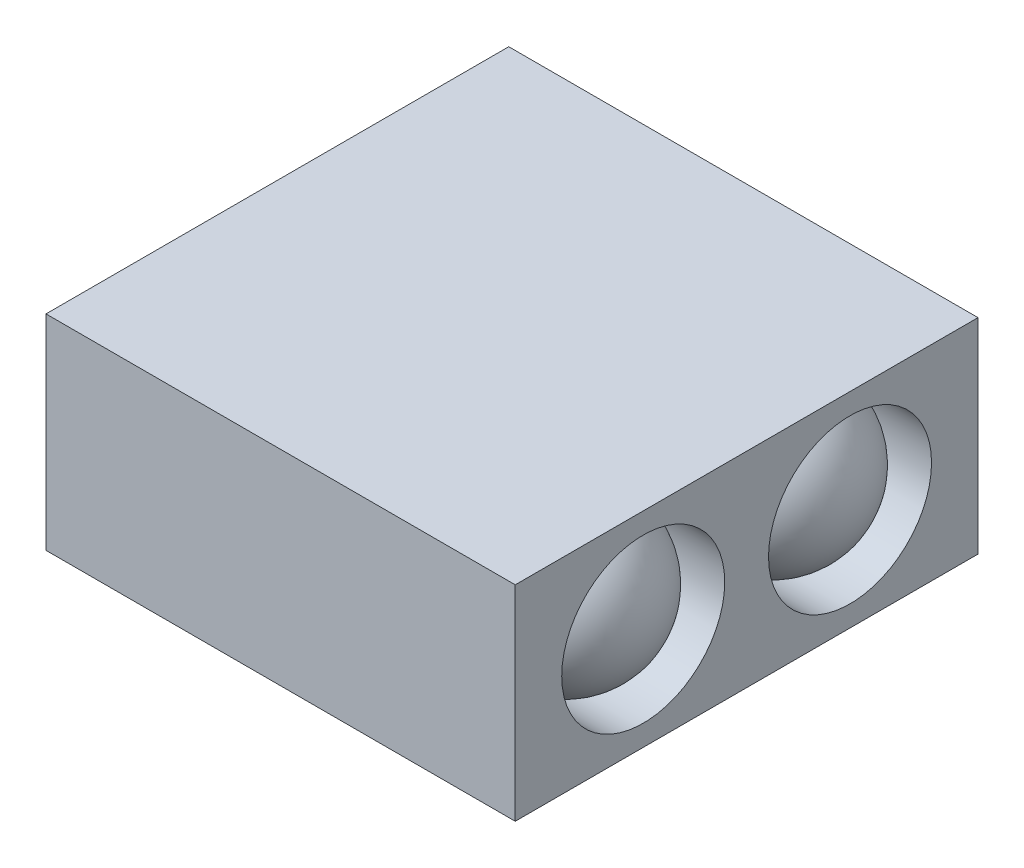
ISO-10303-21;
HEADER;
FILE_DESCRIPTION(('STEP AP214'),'2;1');
FILE_NAME('part.step','',(''),(''),'','','');
FILE_SCHEMA(('AUTOMOTIVE_DESIGN { 1 0 10303 214 1 1 1 1 }'));
ENDSEC;
DATA;
#1=APPLICATION_CONTEXT('core data for automotive mechanical design processes');
#2=APPLICATION_PROTOCOL_DEFINITION('international standard','automotive_design',2000,#1);
#3=PRODUCT_CONTEXT('',#1,'mechanical');
#4=PRODUCT('Part','Part','',(#3));
#5=PRODUCT_RELATED_PRODUCT_CATEGORY('part','',(#4));
#6=PRODUCT_DEFINITION_FORMATION('','',#4);
#7=PRODUCT_DEFINITION_CONTEXT('part definition',#1,'design');
#8=PRODUCT_DEFINITION('design','',#6,#7);
#9=PRODUCT_DEFINITION_SHAPE('','',#8);
#10=(LENGTH_UNIT() NAMED_UNIT(*) SI_UNIT(.MILLI.,.METRE.));
#11=(NAMED_UNIT(*) PLANE_ANGLE_UNIT() SI_UNIT($,.RADIAN.));
#12=(NAMED_UNIT(*) SI_UNIT($,.STERADIAN.) SOLID_ANGLE_UNIT());
#13=UNCERTAINTY_MEASURE_WITH_UNIT(LENGTH_MEASURE(1.E-05),#10,'distance_accuracy_value','');
#14=(GEOMETRIC_REPRESENTATION_CONTEXT(3) GLOBAL_UNCERTAINTY_ASSIGNED_CONTEXT((#13)) GLOBAL_UNIT_ASSIGNED_CONTEXT((#10,
#11,#12)) REPRESENTATION_CONTEXT('',''));
#15=CARTESIAN_POINT('',(0.,0.,0.));
#16=DIRECTION('',(0.,0.,1.));
#17=DIRECTION('',(1.,0.,0.));
#18=AXIS2_PLACEMENT_3D('',#15,#16,#17);
#19=CARTESIAN_POINT('',(181.,158.,178.5));
#20=DIRECTION('',(-1.,0.,0.));
#21=DIRECTION('',(0.,0.,1.));
#22=AXIS2_PLACEMENT_3D('',#19,#20,#21);
#23=PLANE('',#22);
#24=CARTESIAN_POINT('',(181.,79.,79.7740259901767));
#25=DIRECTION('',(1.,0.,0.));
#26=DIRECTION('',(0.,0.,-1.));
#27=AXIS2_PLACEMENT_3D('',#24,#25,#26);
#28=CIRCLE('',#27,62.8771162109275);
#29=CARTESIAN_POINT('',(181.,79.,16.8969097792492));
#30=VERTEX_POINT('',#29);
#31=EDGE_CURVE('E121',#30,#30,#28,.T.);
#32=ORIENTED_EDGE('',*,*,#31,.F.);
#33=EDGE_LOOP('',(#32));
#34=FACE_BOUND('',#33,.T.);
#35=CARTESIAN_POINT('',(181.,79.,-79.7740259901767));
#36=DIRECTION('',(1.,0.,0.));
#37=DIRECTION('',(0.,0.,1.));
#38=AXIS2_PLACEMENT_3D('',#35,#36,#37);
#39=CIRCLE('',#38,62.8771162109275);
#40=CARTESIAN_POINT('',(181.,79.,-142.651142201104));
#41=VERTEX_POINT('',#40);
#42=EDGE_CURVE('E115',#41,#41,#39,.T.);
#43=ORIENTED_EDGE('',*,*,#42,.F.);
#44=EDGE_LOOP('',(#43));
#45=FACE_BOUND('',#44,.T.);
#46=DIRECTION('',(0.,0.,-1.));
#47=VECTOR('',#46,1.);
#48=CARTESIAN_POINT('',(181.,0.,178.5));
#49=LINE('',#48,#47);
#50=CARTESIAN_POINT('',(181.,0.,178.5));
#51=VERTEX_POINT('',#50);
#52=CARTESIAN_POINT('',(181.,0.,-178.5));
#53=VERTEX_POINT('',#52);
#54=EDGE_CURVE('E101',#51,#53,#49,.T.);
#55=ORIENTED_EDGE('',*,*,#54,.T.);
#56=DIRECTION('',(0.,-1.,0.));
#57=VECTOR('',#56,1.);
#58=CARTESIAN_POINT('',(181.,158.,-178.5));
#59=LINE('',#58,#57);
#60=CARTESIAN_POINT('',(181.,158.,-178.5));
#61=VERTEX_POINT('',#60);
#62=EDGE_CURVE('E11',#61,#53,#59,.T.);
#63=ORIENTED_EDGE('',*,*,#62,.F.);
#64=DIRECTION('',(0.,0.,-1.));
#65=VECTOR('',#64,1.);
#66=CARTESIAN_POINT('',(181.,158.,178.5));
#67=LINE('',#66,#65);
#68=CARTESIAN_POINT('',(181.,158.,178.5));
#69=VERTEX_POINT('',#68);
#70=EDGE_CURVE('E89',#69,#61,#67,.T.);
#71=ORIENTED_EDGE('',*,*,#70,.F.);
#72=DIRECTION('',(0.,-1.,0.));
#73=VECTOR('',#72,1.);
#74=CARTESIAN_POINT('',(181.,158.,178.5));
#75=LINE('',#74,#73);
#76=EDGE_CURVE('E97',#69,#51,#75,.T.);
#77=ORIENTED_EDGE('',*,*,#76,.T.);
#78=EDGE_LOOP('',(#55,#63,#71,#77));
#79=FACE_BOUND('',#78,.T.);
#80=ADVANCED_FACE('F38',(#34,#45,#79),#23,.F.);
#81=CARTESIAN_POINT('',(-181.,158.,-178.5));
#82=DIRECTION('',(0.,0.,1.));
#83=DIRECTION('',(1.,0.,0.));
#84=AXIS2_PLACEMENT_3D('',#81,#82,#83);
#85=PLANE('',#84);
#86=DIRECTION('',(-1.,0.,0.));
#87=VECTOR('',#86,1.);
#88=CARTESIAN_POINT('',(-181.,0.,-178.5));
#89=LINE('',#88,#87);
#90=CARTESIAN_POINT('',(-181.,0.,-178.5));
#91=VERTEX_POINT('',#90);
#92=EDGE_CURVE('E93',#53,#91,#89,.T.);
#93=ORIENTED_EDGE('',*,*,#92,.T.);
#94=DIRECTION('',(0.,-1.,0.));
#95=VECTOR('',#94,1.);
#96=CARTESIAN_POINT('',(-181.,158.,-178.5));
#97=LINE('',#96,#95);
#98=CARTESIAN_POINT('',(-181.,158.,-178.5));
#99=VERTEX_POINT('',#98);
#100=EDGE_CURVE('E46',#99,#91,#97,.T.);
#101=ORIENTED_EDGE('',*,*,#100,.F.);
#102=DIRECTION('',(-1.,0.,0.));
#103=VECTOR('',#102,1.);
#104=CARTESIAN_POINT('',(-181.,158.,-178.5));
#105=LINE('',#104,#103);
#106=EDGE_CURVE('E84',#61,#99,#105,.T.);
#107=ORIENTED_EDGE('',*,*,#106,.F.);
#108=ORIENTED_EDGE('',*,*,#62,.T.);
#109=EDGE_LOOP('',(#93,#101,#107,#108));
#110=FACE_BOUND('',#109,.T.);
#111=ADVANCED_FACE('F92',(#110),#85,.F.);
#112=CARTESIAN_POINT('',(-181.,158.,178.5));
#113=DIRECTION('',(1.,0.,0.));
#114=DIRECTION('',(0.,0.,-1.));
#115=AXIS2_PLACEMENT_3D('',#112,#113,#114);
#116=PLANE('',#115);
#117=DIRECTION('',(0.,0.,1.));
#118=VECTOR('',#117,1.);
#119=CARTESIAN_POINT('',(-181.,0.,178.5));
#120=LINE('',#119,#118);
#121=CARTESIAN_POINT('',(-181.,0.,178.5));
#122=VERTEX_POINT('',#121);
#123=EDGE_CURVE('E71',#91,#122,#120,.T.);
#124=ORIENTED_EDGE('',*,*,#123,.T.);
#125=DIRECTION('',(0.,-1.,0.));
#126=VECTOR('',#125,1.);
#127=CARTESIAN_POINT('',(-181.,158.,178.5));
#128=LINE('',#127,#126);
#129=CARTESIAN_POINT('',(-181.,158.,178.5));
#130=VERTEX_POINT('',#129);
#131=EDGE_CURVE('E94',#130,#122,#128,.T.);
#132=ORIENTED_EDGE('',*,*,#131,.F.);
#133=DIRECTION('',(0.,0.,1.));
#134=VECTOR('',#133,1.);
#135=CARTESIAN_POINT('',(-181.,158.,178.5));
#136=LINE('',#135,#134);
#137=EDGE_CURVE('E87',#99,#130,#136,.T.);
#138=ORIENTED_EDGE('',*,*,#137,.F.);
#139=ORIENTED_EDGE('',*,*,#100,.T.);
#140=EDGE_LOOP('',(#124,#132,#138,#139));
#141=FACE_BOUND('',#140,.T.);
#142=ADVANCED_FACE('F95',(#141),#116,.F.);
#143=CARTESIAN_POINT('',(-181.,158.,178.5));
#144=DIRECTION('',(0.,0.,-1.));
#145=DIRECTION('',(-1.,0.,0.));
#146=AXIS2_PLACEMENT_3D('',#143,#144,#145);
#147=PLANE('',#146);
#148=DIRECTION('',(1.,0.,0.));
#149=VECTOR('',#148,1.);
#150=CARTESIAN_POINT('',(-181.,0.,178.5));
#151=LINE('',#150,#149);
#152=EDGE_CURVE('E77',#122,#51,#151,.T.);
#153=ORIENTED_EDGE('',*,*,#152,.T.);
#154=ORIENTED_EDGE('',*,*,#76,.F.);
#155=DIRECTION('',(1.,0.,0.));
#156=VECTOR('',#155,1.);
#157=CARTESIAN_POINT('',(-181.,158.,178.5));
#158=LINE('',#157,#156);
#159=EDGE_CURVE('E54',#130,#69,#158,.T.);
#160=ORIENTED_EDGE('',*,*,#159,.F.);
#161=ORIENTED_EDGE('',*,*,#131,.T.);
#162=EDGE_LOOP('',(#153,#154,#160,#161));
#163=FACE_BOUND('',#162,.T.);
#164=ADVANCED_FACE('F109',(#163),#147,.F.);
#165=CARTESIAN_POINT('',(0.,158.,0.));
#166=DIRECTION('',(0.,-1.,0.));
#167=DIRECTION('',(0.,0.,-1.));
#168=AXIS2_PLACEMENT_3D('',#165,#166,#167);
#169=PLANE('',#168);
#170=ORIENTED_EDGE('',*,*,#70,.T.);
#171=ORIENTED_EDGE('',*,*,#106,.T.);
#172=ORIENTED_EDGE('',*,*,#137,.T.);
#173=ORIENTED_EDGE('',*,*,#159,.T.);
#174=EDGE_LOOP('',(#170,#171,#172,#173));
#175=FACE_BOUND('',#174,.T.);
#176=ADVANCED_FACE('F85',(#175),#169,.F.);
#177=CARTESIAN_POINT('',(0.,0.,0.));
#178=DIRECTION('',(0.,-1.,0.));
#179=DIRECTION('',(0.,0.,-1.));
#180=AXIS2_PLACEMENT_3D('',#177,#178,#179);
#181=PLANE('',#180);
#182=ORIENTED_EDGE('',*,*,#54,.F.);
#183=ORIENTED_EDGE('',*,*,#152,.F.);
#184=ORIENTED_EDGE('',*,*,#123,.F.);
#185=ORIENTED_EDGE('',*,*,#92,.F.);
#186=EDGE_LOOP('',(#182,#183,#184,#185));
#187=FACE_BOUND('',#186,.T.);
#188=ADVANCED_FACE('F112',(#187),#181,.T.);
#189=CARTESIAN_POINT('',(121.,79.,-79.7740259901767));
#190=DIRECTION('',(1.,0.,0.));
#191=DIRECTION('',(0.,0.,-1.));
#192=AXIS2_PLACEMENT_3D('',#189,#190,#191);
#193=CYLINDRICAL_SURFACE('',#192,62.8771162109275);
#194=CARTESIAN_POINT('',(121.,79.,-79.7740259901767));
#195=DIRECTION('',(1.,0.,0.));
#196=DIRECTION('',(0.,0.,1.));
#197=AXIS2_PLACEMENT_3D('',#194,#195,#196);
#198=CIRCLE('',#197,62.8771162109275);
#199=CARTESIAN_POINT('',(121.,79.,-142.651142201104));
#200=VERTEX_POINT('',#199);
#201=EDGE_CURVE('E118',#200,#200,#198,.T.);
#202=CARTESIAN_POINT('',(121.,79.,-142.651142201104));
#203=CARTESIAN_POINT('',(121.625,79.,-142.651142201104));
#204=CARTESIAN_POINT('',(122.25,79.,-142.651142201104));
#205=CARTESIAN_POINT('',(123.5,79.,-142.651142201104));
#206=CARTESIAN_POINT('',(124.125,79.,-142.651142201104));
#207=CARTESIAN_POINT('',(125.375,79.,-142.651142201104));
#208=CARTESIAN_POINT('',(126.,79.,-142.651142201104));
#209=CARTESIAN_POINT('',(127.25,79.,-142.651142201104));
#210=CARTESIAN_POINT('',(127.875,79.,-142.651142201104));
#211=CARTESIAN_POINT('',(129.125,79.,-142.651142201104));
#212=CARTESIAN_POINT('',(129.75,79.,-142.651142201104));
#213=CARTESIAN_POINT('',(131.,79.,-142.651142201104));
#214=CARTESIAN_POINT('',(131.625,79.,-142.651142201104));
#215=CARTESIAN_POINT('',(132.875,79.,-142.651142201104));
#216=CARTESIAN_POINT('',(133.5,79.,-142.651142201104));
#217=CARTESIAN_POINT('',(134.75,79.,-142.651142201104));
#218=CARTESIAN_POINT('',(135.375,79.,-142.651142201104));
#219=CARTESIAN_POINT('',(136.625,79.,-142.651142201104));
#220=CARTESIAN_POINT('',(137.25,79.,-142.651142201104));
#221=CARTESIAN_POINT('',(138.5,79.,-142.651142201104));
#222=CARTESIAN_POINT('',(139.125,79.,-142.651142201104));
#223=CARTESIAN_POINT('',(140.375,79.,-142.651142201104));
#224=CARTESIAN_POINT('',(141.,79.,-142.651142201104));
#225=CARTESIAN_POINT('',(142.25,79.,-142.651142201104));
#226=CARTESIAN_POINT('',(142.875,79.,-142.651142201104));
#227=CARTESIAN_POINT('',(144.125,79.,-142.651142201104));
#228=CARTESIAN_POINT('',(144.75,79.,-142.651142201104));
#229=CARTESIAN_POINT('',(146.,79.,-142.651142201104));
#230=CARTESIAN_POINT('',(146.625,79.,-142.651142201104));
#231=CARTESIAN_POINT('',(147.875,79.,-142.651142201104));
#232=CARTESIAN_POINT('',(148.5,79.,-142.651142201104));
#233=CARTESIAN_POINT('',(149.75,79.,-142.651142201104));
#234=CARTESIAN_POINT('',(150.375,79.,-142.651142201104));
#235=CARTESIAN_POINT('',(151.625,79.,-142.651142201104));
#236=CARTESIAN_POINT('',(152.25,79.,-142.651142201104));
#237=CARTESIAN_POINT('',(153.5,79.,-142.651142201104));
#238=CARTESIAN_POINT('',(154.125,79.,-142.651142201104));
#239=CARTESIAN_POINT('',(155.375,79.,-142.651142201104));
#240=CARTESIAN_POINT('',(156.,79.,-142.651142201104));
#241=CARTESIAN_POINT('',(157.25,79.,-142.651142201104));
#242=CARTESIAN_POINT('',(157.875,79.,-142.651142201104));
#243=CARTESIAN_POINT('',(159.125,79.,-142.651142201104));
#244=CARTESIAN_POINT('',(159.75,79.,-142.651142201104));
#245=CARTESIAN_POINT('',(161.,79.,-142.651142201104));
#246=CARTESIAN_POINT('',(161.625,79.,-142.651142201104));
#247=CARTESIAN_POINT('',(162.875,79.,-142.651142201104));
#248=CARTESIAN_POINT('',(163.5,79.,-142.651142201104));
#249=CARTESIAN_POINT('',(164.75,79.,-142.651142201104));
#250=CARTESIAN_POINT('',(165.375,79.,-142.651142201104));
#251=CARTESIAN_POINT('',(166.625,79.,-142.651142201104));
#252=CARTESIAN_POINT('',(167.25,79.,-142.651142201104));
#253=CARTESIAN_POINT('',(168.5,79.,-142.651142201104));
#254=CARTESIAN_POINT('',(169.125,79.,-142.651142201104));
#255=CARTESIAN_POINT('',(170.375,79.,-142.651142201104));
#256=CARTESIAN_POINT('',(171.,79.,-142.651142201104));
#257=CARTESIAN_POINT('',(172.25,79.,-142.651142201104));
#258=CARTESIAN_POINT('',(172.875,79.,-142.651142201104));
#259=CARTESIAN_POINT('',(174.125,79.,-142.651142201104));
#260=CARTESIAN_POINT('',(174.75,79.,-142.651142201104));
#261=CARTESIAN_POINT('',(176.,79.,-142.651142201104));
#262=CARTESIAN_POINT('',(176.625,79.,-142.651142201104));
#263=CARTESIAN_POINT('',(177.875,79.,-142.651142201104));
#264=CARTESIAN_POINT('',(178.5,79.,-142.651142201104));
#265=CARTESIAN_POINT('',(179.75,79.,-142.651142201104));
#266=CARTESIAN_POINT('',(180.375,79.,-142.651142201104));
#267=CARTESIAN_POINT('',(181.,79.,-142.651142201104));
#268=B_SPLINE_CURVE_WITH_KNOTS('',3,(#202,#203,#204,#205,#206,#207,#208,#209,#210,#211,#212,
#213,#214,#215,#216,#217,#218,#219,#220,#221,#222,#223,#224,#225,#226,#227,#228,#229,#230,#231,
#232,#233,#234,#235,#236,#237,#238,#239,#240,#241,#242,#243,#244,#245,#246,#247,#248,#249,#250,
#251,#252,#253,#254,#255,#256,#257,#258,#259,#260,#261,#262,#263,#264,#265,#266,#267),
.UNSPECIFIED.,.F.,.F.,(4,2,2,2,2,2,2,2,2,2,2,2,2,2,2,2,2,2,2,2,2,2,2,2,2,2,2,2,2,2,2,2,4),(0.,
1.875,3.75,5.62500000000001,7.49999999999999,9.37500000000001,11.25,13.125,15.,16.875,18.75,
20.625,22.5,24.375,26.25,28.125,30.,31.875,33.75,35.625,37.5,39.375,41.25,43.125,45.,46.875,
48.75,50.625,52.5,54.375,56.25,58.125,60.),.UNSPECIFIED.);
#269=EDGE_CURVE('BSEAM132',#200,#41,#268,.T.);
#270=ORIENTED_EDGE('',*,*,#201,.F.);
#271=ORIENTED_EDGE('',*,*,#42,.T.);
#272=ORIENTED_EDGE('',*,*,#269,.T.);
#273=ORIENTED_EDGE('',*,*,#269,.F.);
#274=EDGE_LOOP('',(#270,#272,#271,#273));
#275=FACE_BOUND('',#274,.T.);
#276=ADVANCED_FACE('F132',(#275),#193,.F.);
#277=CARTESIAN_POINT('',(121.,79.,79.7740259901767));
#278=DIRECTION('',(1.,0.,0.));
#279=DIRECTION('',(0.,0.,-1.));
#280=AXIS2_PLACEMENT_3D('',#277,#278,#279);
#281=CYLINDRICAL_SURFACE('',#280,62.8771162109275);
#282=CARTESIAN_POINT('',(121.,79.,79.7740259901767));
#283=DIRECTION('',(1.,0.,0.));
#284=DIRECTION('',(0.,0.,-1.));
#285=AXIS2_PLACEMENT_3D('',#282,#283,#284);
#286=CIRCLE('',#285,62.8771162109275);
#287=CARTESIAN_POINT('',(121.,79.,16.8969097792492));
#288=VERTEX_POINT('',#287);
#289=EDGE_CURVE('E104',#288,#288,#286,.T.);
#290=CARTESIAN_POINT('',(121.,79.,16.8969097792492));
#291=CARTESIAN_POINT('',(121.625,79.,16.8969097792492));
#292=CARTESIAN_POINT('',(122.25,79.,16.8969097792492));
#293=CARTESIAN_POINT('',(123.5,79.,16.8969097792492));
#294=CARTESIAN_POINT('',(124.125,79.,16.8969097792492));
#295=CARTESIAN_POINT('',(125.375,79.,16.8969097792492));
#296=CARTESIAN_POINT('',(126.,79.,16.8969097792492));
#297=CARTESIAN_POINT('',(127.25,79.,16.8969097792492));
#298=CARTESIAN_POINT('',(127.875,79.,16.8969097792492));
#299=CARTESIAN_POINT('',(129.125,79.,16.8969097792492));
#300=CARTESIAN_POINT('',(129.75,79.,16.8969097792492));
#301=CARTESIAN_POINT('',(131.,79.,16.8969097792492));
#302=CARTESIAN_POINT('',(131.625,79.,16.8969097792492));
#303=CARTESIAN_POINT('',(132.875,79.,16.8969097792492));
#304=CARTESIAN_POINT('',(133.5,79.,16.8969097792492));
#305=CARTESIAN_POINT('',(134.75,79.,16.8969097792492));
#306=CARTESIAN_POINT('',(135.375,79.,16.8969097792492));
#307=CARTESIAN_POINT('',(136.625,79.,16.8969097792492));
#308=CARTESIAN_POINT('',(137.25,79.,16.8969097792492));
#309=CARTESIAN_POINT('',(138.5,79.,16.8969097792492));
#310=CARTESIAN_POINT('',(139.125,79.,16.8969097792492));
#311=CARTESIAN_POINT('',(140.375,79.,16.8969097792492));
#312=CARTESIAN_POINT('',(141.,79.,16.8969097792492));
#313=CARTESIAN_POINT('',(142.25,79.,16.8969097792492));
#314=CARTESIAN_POINT('',(142.875,79.,16.8969097792492));
#315=CARTESIAN_POINT('',(144.125,79.,16.8969097792492));
#316=CARTESIAN_POINT('',(144.75,79.,16.8969097792492));
#317=CARTESIAN_POINT('',(146.,79.,16.8969097792492));
#318=CARTESIAN_POINT('',(146.625,79.,16.8969097792492));
#319=CARTESIAN_POINT('',(147.875,79.,16.8969097792492));
#320=CARTESIAN_POINT('',(148.5,79.,16.8969097792492));
#321=CARTESIAN_POINT('',(149.75,79.,16.8969097792492));
#322=CARTESIAN_POINT('',(150.375,79.,16.8969097792492));
#323=CARTESIAN_POINT('',(151.625,79.,16.8969097792492));
#324=CARTESIAN_POINT('',(152.25,79.,16.8969097792492));
#325=CARTESIAN_POINT('',(153.5,79.,16.8969097792492));
#326=CARTESIAN_POINT('',(154.125,79.,16.8969097792492));
#327=CARTESIAN_POINT('',(155.375,79.,16.8969097792492));
#328=CARTESIAN_POINT('',(156.,79.,16.8969097792492));
#329=CARTESIAN_POINT('',(157.25,79.,16.8969097792492));
#330=CARTESIAN_POINT('',(157.875,79.,16.8969097792492));
#331=CARTESIAN_POINT('',(159.125,79.,16.8969097792492));
#332=CARTESIAN_POINT('',(159.75,79.,16.8969097792492));
#333=CARTESIAN_POINT('',(161.,79.,16.8969097792492));
#334=CARTESIAN_POINT('',(161.625,79.,16.8969097792492));
#335=CARTESIAN_POINT('',(162.875,79.,16.8969097792492));
#336=CARTESIAN_POINT('',(163.5,79.,16.8969097792492));
#337=CARTESIAN_POINT('',(164.75,79.,16.8969097792492));
#338=CARTESIAN_POINT('',(165.375,79.,16.8969097792492));
#339=CARTESIAN_POINT('',(166.625,79.,16.8969097792492));
#340=CARTESIAN_POINT('',(167.25,79.,16.8969097792492));
#341=CARTESIAN_POINT('',(168.5,79.,16.8969097792492));
#342=CARTESIAN_POINT('',(169.125,79.,16.8969097792492));
#343=CARTESIAN_POINT('',(170.375,79.,16.8969097792492));
#344=CARTESIAN_POINT('',(171.,79.,16.8969097792492));
#345=CARTESIAN_POINT('',(172.25,79.,16.8969097792492));
#346=CARTESIAN_POINT('',(172.875,79.,16.8969097792492));
#347=CARTESIAN_POINT('',(174.125,79.,16.8969097792492));
#348=CARTESIAN_POINT('',(174.75,79.,16.8969097792492));
#349=CARTESIAN_POINT('',(176.,79.,16.8969097792492));
#350=CARTESIAN_POINT('',(176.625,79.,16.8969097792492));
#351=CARTESIAN_POINT('',(177.875,79.,16.8969097792492));
#352=CARTESIAN_POINT('',(178.5,79.,16.8969097792492));
#353=CARTESIAN_POINT('',(179.75,79.,16.8969097792492));
#354=CARTESIAN_POINT('',(180.375,79.,16.8969097792492));
#355=CARTESIAN_POINT('',(181.,79.,16.8969097792492));
#356=B_SPLINE_CURVE_WITH_KNOTS('',3,(#290,#291,#292,#293,#294,#295,#296,#297,#298,#299,#300,
#301,#302,#303,#304,#305,#306,#307,#308,#309,#310,#311,#312,#313,#314,#315,#316,#317,#318,#319,
#320,#321,#322,#323,#324,#325,#326,#327,#328,#329,#330,#331,#332,#333,#334,#335,#336,#337,#338,
#339,#340,#341,#342,#343,#344,#345,#346,#347,#348,#349,#350,#351,#352,#353,#354,#355),
.UNSPECIFIED.,.F.,.F.,(4,2,2,2,2,2,2,2,2,2,2,2,2,2,2,2,2,2,2,2,2,2,2,2,2,2,2,2,2,2,2,2,4),(0.,
1.875,3.75,5.62500000000001,7.49999999999999,9.37500000000001,11.25,13.125,15.,16.875,18.75,
20.625,22.5,24.375,26.25,28.125,30.,31.875,33.75,35.625,37.5,39.375,41.25,43.125,45.,46.875,
48.75,50.625,52.5,54.375,56.25,58.125,60.),.UNSPECIFIED.);
#357=EDGE_CURVE('BSEAM129',#288,#30,#356,.T.);
#358=ORIENTED_EDGE('',*,*,#289,.F.);
#359=ORIENTED_EDGE('',*,*,#31,.T.);
#360=ORIENTED_EDGE('',*,*,#357,.T.);
#361=ORIENTED_EDGE('',*,*,#357,.F.);
#362=EDGE_LOOP('',(#358,#360,#359,#361));
#363=FACE_BOUND('',#362,.T.);
#364=ADVANCED_FACE('F129',(#363),#281,.F.);
#365=CARTESIAN_POINT('',(121.,79.,79.7740259901767));
#366=DIRECTION('',(0.,-1.,0.));
#367=DIRECTION('',(0.,0.,-1.));
#368=AXIS2_PLACEMENT_3D('',#365,#366,#367);
#369=SPHERICAL_SURFACE('',#368,62.8771162109275);
#370=CARTESIAN_POINT('',(121.,79.,79.7740259901767));
#371=DIRECTION('',(1.,0.,0.));
#372=DIRECTION('',(0.,0.,-1.));
#373=AXIS2_PLACEMENT_3D('',#370,#371,#372);
#374=SPHERICAL_SURFACE('',#373,62.8771162109275);
#375=ORIENTED_EDGE('',*,*,#289,.T.);
#376=EDGE_LOOP('',(#375));
#377=FACE_BOUND('',#376,.T.);
#378=ADVANCED_FACE('F127',(#377),#374,.T.);
#379=CARTESIAN_POINT('',(121.,79.,-79.7740259901767));
#380=DIRECTION('',(0.,-1.,0.));
#381=DIRECTION('',(0.,0.,-1.));
#382=AXIS2_PLACEMENT_3D('',#379,#380,#381);
#383=SPHERICAL_SURFACE('',#382,62.8771162109275);
#384=CARTESIAN_POINT('',(121.,79.,-79.7740259901767));
#385=DIRECTION('',(1.,0.,0.));
#386=DIRECTION('',(0.,0.,1.));
#387=AXIS2_PLACEMENT_3D('',#384,#385,#386);
#388=SPHERICAL_SURFACE('',#387,62.8771162109275);
#389=ORIENTED_EDGE('',*,*,#201,.T.);
#390=EDGE_LOOP('',(#389));
#391=FACE_BOUND('',#390,.T.);
#392=ADVANCED_FACE('F200',(#391),#388,.T.);
#393=CLOSED_SHELL('',(#80,#111,#142,#164,#176,#188,#276,#364,#378,#392));
#394=MANIFOLD_SOLID_BREP('B2',#393);
#395=ADVANCED_BREP_SHAPE_REPRESENTATION('',(#18,#394),#14);
#396=SHAPE_DEFINITION_REPRESENTATION(#9,#395);
ENDSEC;
END-ISO-10303-21;
